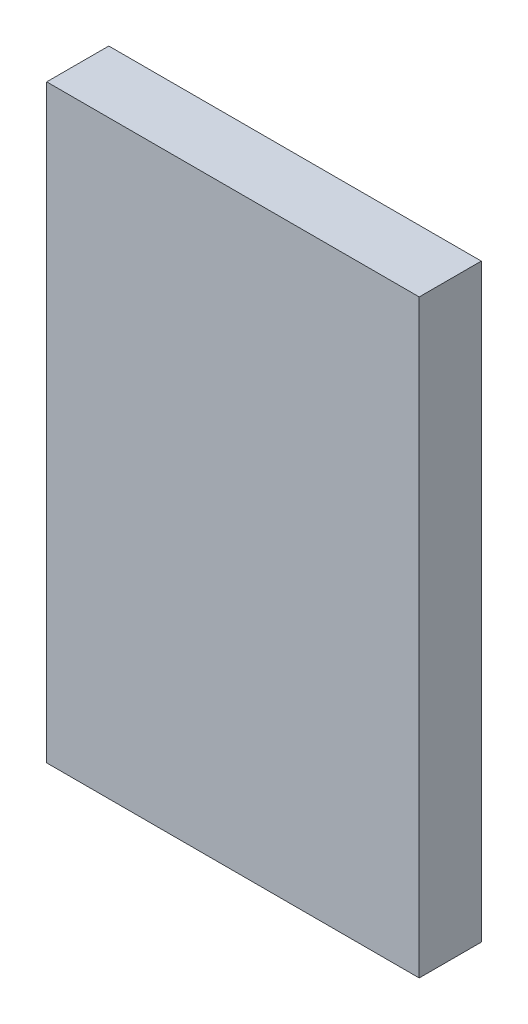
ISO-10303-21;
HEADER;
FILE_DESCRIPTION(('STEP AP214'),'2;1');
FILE_NAME('part.step','',(''),(''),'','','');
FILE_SCHEMA(('AUTOMOTIVE_DESIGN { 1 0 10303 214 1 1 1 1 }'));
ENDSEC;
DATA;
#1=APPLICATION_CONTEXT('core data for automotive mechanical design processes');
#2=APPLICATION_PROTOCOL_DEFINITION('international standard','automotive_design',2000,#1);
#3=PRODUCT_CONTEXT('',#1,'mechanical');
#4=PRODUCT('Part','Part','',(#3));
#5=PRODUCT_RELATED_PRODUCT_CATEGORY('part','',(#4));
#6=PRODUCT_DEFINITION_FORMATION('','',#4);
#7=PRODUCT_DEFINITION_CONTEXT('part definition',#1,'design');
#8=PRODUCT_DEFINITION('design','',#6,#7);
#9=PRODUCT_DEFINITION_SHAPE('','',#8);
#10=(LENGTH_UNIT() NAMED_UNIT(*) SI_UNIT(.MILLI.,.METRE.));
#11=(NAMED_UNIT(*) PLANE_ANGLE_UNIT() SI_UNIT($,.RADIAN.));
#12=(NAMED_UNIT(*) SI_UNIT($,.STERADIAN.) SOLID_ANGLE_UNIT());
#13=UNCERTAINTY_MEASURE_WITH_UNIT(LENGTH_MEASURE(1.E-05),#10,'distance_accuracy_value','');
#14=(GEOMETRIC_REPRESENTATION_CONTEXT(3) GLOBAL_UNCERTAINTY_ASSIGNED_CONTEXT((#13)) GLOBAL_UNIT_ASSIGNED_CONTEXT((#10,
#11,#12)) REPRESENTATION_CONTEXT('',''));
#15=CARTESIAN_POINT('',(0.,0.,0.));
#16=DIRECTION('',(0.,0.,1.));
#17=DIRECTION('',(1.,0.,0.));
#18=AXIS2_PLACEMENT_3D('',#15,#16,#17);
#19=CARTESIAN_POINT('',(-12.,19.,4.));
#20=DIRECTION('',(1.,0.,0.));
#21=DIRECTION('',(0.,1.,0.));
#22=AXIS2_PLACEMENT_3D('',#19,#20,#21);
#23=PLANE('',#22);
#24=DIRECTION('',(0.,-1.,0.));
#25=VECTOR('',#24,1.);
#26=CARTESIAN_POINT('',(-12.,19.,0.));
#27=LINE('',#26,#25);
#28=CARTESIAN_POINT('',(-12.,19.,0.));
#29=VERTEX_POINT('',#28);
#30=CARTESIAN_POINT('',(-12.,-19.,0.));
#31=VERTEX_POINT('',#30);
#32=EDGE_CURVE('E98',#29,#31,#27,.T.);
#33=ORIENTED_EDGE('',*,*,#32,.T.);
#34=DIRECTION('',(0.,0.,-1.));
#35=VECTOR('',#34,1.);
#36=CARTESIAN_POINT('',(-12.,-19.,4.));
#37=LINE('',#36,#35);
#38=CARTESIAN_POINT('',(-12.,-19.,4.));
#39=VERTEX_POINT('',#38);
#40=EDGE_CURVE('E11',#39,#31,#37,.T.);
#41=ORIENTED_EDGE('',*,*,#40,.F.);
#42=DIRECTION('',(0.,-1.,0.));
#43=VECTOR('',#42,1.);
#44=CARTESIAN_POINT('',(-12.,19.,4.));
#45=LINE('',#44,#43);
#46=CARTESIAN_POINT('',(-12.,19.,4.));
#47=VERTEX_POINT('',#46);
#48=EDGE_CURVE('E86',#47,#39,#45,.T.);
#49=ORIENTED_EDGE('',*,*,#48,.F.);
#50=DIRECTION('',(0.,0.,-1.));
#51=VECTOR('',#50,1.);
#52=CARTESIAN_POINT('',(-12.,19.,4.));
#53=LINE('',#52,#51);
#54=EDGE_CURVE('E94',#47,#29,#53,.T.);
#55=ORIENTED_EDGE('',*,*,#54,.T.);
#56=EDGE_LOOP('',(#33,#41,#49,#55));
#57=FACE_BOUND('',#56,.T.);
#58=ADVANCED_FACE('F35',(#57),#23,.F.);
#59=CARTESIAN_POINT('',(12.,-19.,4.));
#60=DIRECTION('',(0.,1.,0.));
#61=DIRECTION('',(-1.,0.,0.));
#62=AXIS2_PLACEMENT_3D('',#59,#60,#61);
#63=PLANE('',#62);
#64=DIRECTION('',(1.,0.,0.));
#65=VECTOR('',#64,1.);
#66=CARTESIAN_POINT('',(12.,-19.,0.));
#67=LINE('',#66,#65);
#68=CARTESIAN_POINT('',(12.,-19.,0.));
#69=VERTEX_POINT('',#68);
#70=EDGE_CURVE('E90',#31,#69,#67,.T.);
#71=ORIENTED_EDGE('',*,*,#70,.T.);
#72=DIRECTION('',(0.,0.,-1.));
#73=VECTOR('',#72,1.);
#74=CARTESIAN_POINT('',(12.,-19.,4.));
#75=LINE('',#74,#73);
#76=CARTESIAN_POINT('',(12.,-19.,4.));
#77=VERTEX_POINT('',#76);
#78=EDGE_CURVE('E43',#77,#69,#75,.T.);
#79=ORIENTED_EDGE('',*,*,#78,.F.);
#80=DIRECTION('',(1.,0.,0.));
#81=VECTOR('',#80,1.);
#82=CARTESIAN_POINT('',(12.,-19.,4.));
#83=LINE('',#82,#81);
#84=EDGE_CURVE('E81',#39,#77,#83,.T.);
#85=ORIENTED_EDGE('',*,*,#84,.F.);
#86=ORIENTED_EDGE('',*,*,#40,.T.);
#87=EDGE_LOOP('',(#71,#79,#85,#86));
#88=FACE_BOUND('',#87,.T.);
#89=ADVANCED_FACE('F89',(#88),#63,.F.);
#90=CARTESIAN_POINT('',(12.,19.,4.));
#91=DIRECTION('',(-1.,0.,0.));
#92=DIRECTION('',(0.,-1.,0.));
#93=AXIS2_PLACEMENT_3D('',#90,#91,#92);
#94=PLANE('',#93);
#95=DIRECTION('',(0.,1.,0.));
#96=VECTOR('',#95,1.);
#97=CARTESIAN_POINT('',(12.,19.,0.));
#98=LINE('',#97,#96);
#99=CARTESIAN_POINT('',(12.,19.,0.));
#100=VERTEX_POINT('',#99);
#101=EDGE_CURVE('E68',#69,#100,#98,.T.);
#102=ORIENTED_EDGE('',*,*,#101,.T.);
#103=DIRECTION('',(0.,0.,-1.));
#104=VECTOR('',#103,1.);
#105=CARTESIAN_POINT('',(12.,19.,4.));
#106=LINE('',#105,#104);
#107=CARTESIAN_POINT('',(12.,19.,4.));
#108=VERTEX_POINT('',#107);
#109=EDGE_CURVE('E91',#108,#100,#106,.T.);
#110=ORIENTED_EDGE('',*,*,#109,.F.);
#111=DIRECTION('',(0.,1.,0.));
#112=VECTOR('',#111,1.);
#113=CARTESIAN_POINT('',(12.,19.,4.));
#114=LINE('',#113,#112);
#115=EDGE_CURVE('E84',#77,#108,#114,.T.);
#116=ORIENTED_EDGE('',*,*,#115,.F.);
#117=ORIENTED_EDGE('',*,*,#78,.T.);
#118=EDGE_LOOP('',(#102,#110,#116,#117));
#119=FACE_BOUND('',#118,.T.);
#120=ADVANCED_FACE('F92',(#119),#94,.F.);
#121=CARTESIAN_POINT('',(12.,19.,4.));
#122=DIRECTION('',(0.,-1.,0.));
#123=DIRECTION('',(1.,0.,0.));
#124=AXIS2_PLACEMENT_3D('',#121,#122,#123);
#125=PLANE('',#124);
#126=DIRECTION('',(-1.,0.,0.));
#127=VECTOR('',#126,1.);
#128=CARTESIAN_POINT('',(12.,19.,0.));
#129=LINE('',#128,#127);
#130=EDGE_CURVE('E74',#100,#29,#129,.T.);
#131=ORIENTED_EDGE('',*,*,#130,.T.);
#132=ORIENTED_EDGE('',*,*,#54,.F.);
#133=DIRECTION('',(-1.,0.,0.));
#134=VECTOR('',#133,1.);
#135=CARTESIAN_POINT('',(12.,19.,4.));
#136=LINE('',#135,#134);
#137=EDGE_CURVE('E51',#108,#47,#136,.T.);
#138=ORIENTED_EDGE('',*,*,#137,.F.);
#139=ORIENTED_EDGE('',*,*,#109,.T.);
#140=EDGE_LOOP('',(#131,#132,#138,#139));
#141=FACE_BOUND('',#140,.T.);
#142=ADVANCED_FACE('F105',(#141),#125,.F.);
#143=CARTESIAN_POINT('',(0.,0.,4.));
#144=DIRECTION('',(0.,0.,-1.));
#145=DIRECTION('',(-1.,0.,0.));
#146=AXIS2_PLACEMENT_3D('',#143,#144,#145);
#147=PLANE('',#146);
#148=ORIENTED_EDGE('',*,*,#48,.T.);
#149=ORIENTED_EDGE('',*,*,#84,.T.);
#150=ORIENTED_EDGE('',*,*,#115,.T.);
#151=ORIENTED_EDGE('',*,*,#137,.T.);
#152=EDGE_LOOP('',(#148,#149,#150,#151));
#153=FACE_BOUND('',#152,.T.);
#154=ADVANCED_FACE('F82',(#153),#147,.F.);
#155=CARTESIAN_POINT('',(0.,0.,0.));
#156=DIRECTION('',(0.,0.,-1.));
#157=DIRECTION('',(-1.,0.,0.));
#158=AXIS2_PLACEMENT_3D('',#155,#156,#157);
#159=PLANE('',#158);
#160=ORIENTED_EDGE('',*,*,#32,.F.);
#161=ORIENTED_EDGE('',*,*,#130,.F.);
#162=ORIENTED_EDGE('',*,*,#101,.F.);
#163=ORIENTED_EDGE('',*,*,#70,.F.);
#164=EDGE_LOOP('',(#160,#161,#162,#163));
#165=FACE_BOUND('',#164,.T.);
#166=ADVANCED_FACE('F108',(#165),#159,.T.);
#167=CLOSED_SHELL('',(#58,#89,#120,#142,#154,#166));
#168=MANIFOLD_SOLID_BREP('B2',#167);
#169=ADVANCED_BREP_SHAPE_REPRESENTATION('',(#18,#168),#14);
#170=SHAPE_DEFINITION_REPRESENTATION(#9,#169);
ENDSEC;
END-ISO-10303-21;
